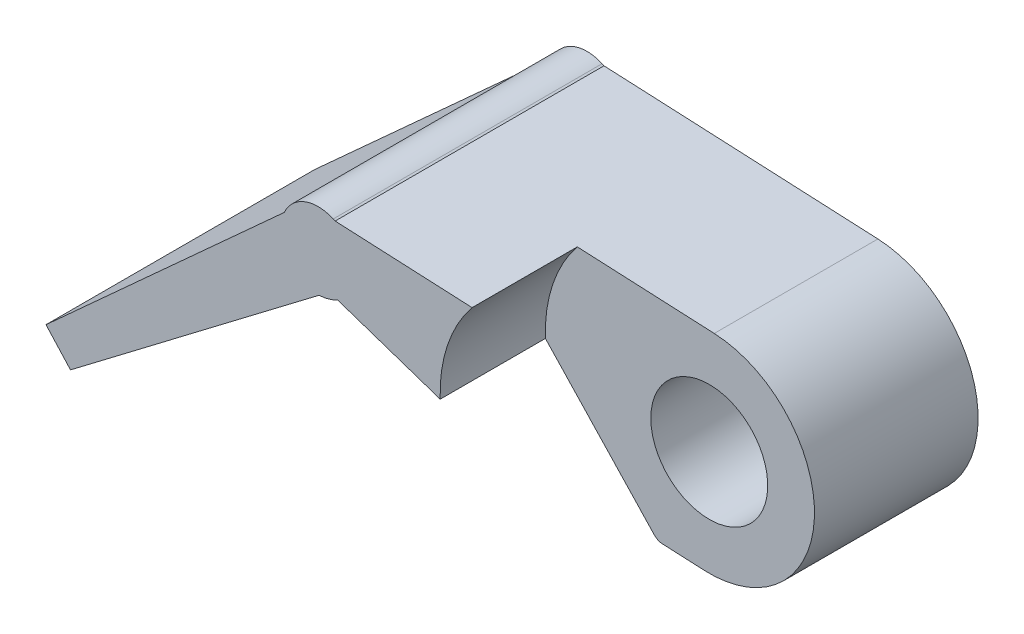
ISO-10303-21;
HEADER;
FILE_DESCRIPTION(('STEP AP214'),'2;1');
FILE_NAME('part.step','',(''),(''),'','','');
FILE_SCHEMA(('AUTOMOTIVE_DESIGN { 1 0 10303 214 1 1 1 1 }'));
ENDSEC;
DATA;
#1=APPLICATION_CONTEXT('core data for automotive mechanical design processes');
#2=APPLICATION_PROTOCOL_DEFINITION('international standard','automotive_design',2000,#1);
#3=PRODUCT_CONTEXT('',#1,'mechanical');
#4=PRODUCT('Part','Part','',(#3));
#5=PRODUCT_RELATED_PRODUCT_CATEGORY('part','',(#4));
#6=PRODUCT_DEFINITION_FORMATION('','',#4);
#7=PRODUCT_DEFINITION_CONTEXT('part definition',#1,'design');
#8=PRODUCT_DEFINITION('design','',#6,#7);
#9=PRODUCT_DEFINITION_SHAPE('','',#8);
#10=(LENGTH_UNIT() NAMED_UNIT(*) SI_UNIT(.MILLI.,.METRE.));
#11=(NAMED_UNIT(*) PLANE_ANGLE_UNIT() SI_UNIT($,.RADIAN.));
#12=(NAMED_UNIT(*) SI_UNIT($,.STERADIAN.) SOLID_ANGLE_UNIT());
#13=UNCERTAINTY_MEASURE_WITH_UNIT(LENGTH_MEASURE(1.E-05),#10,'distance_accuracy_value','');
#14=(GEOMETRIC_REPRESENTATION_CONTEXT(3) GLOBAL_UNCERTAINTY_ASSIGNED_CONTEXT((#13)) GLOBAL_UNIT_ASSIGNED_CONTEXT((#10,
#11,#12)) REPRESENTATION_CONTEXT('',''));
#15=CARTESIAN_POINT('',(0.,0.,0.));
#16=DIRECTION('',(0.,0.,1.));
#17=DIRECTION('',(1.,0.,0.));
#18=AXIS2_PLACEMENT_3D('',#15,#16,#17);
#19=CARTESIAN_POINT('',(-5.01413386203409,4.81339668661748,23.));
#20=DIRECTION('',(-0.605097912293867,0.796151063892779,0.));
#21=DIRECTION('',(-0.796151063892779,-0.605097912293867,0.));
#22=AXIS2_PLACEMENT_3D('',#19,#20,#21);
#23=PLANE('',#22);
#24=DIRECTION('',(0.796151063892779,0.605097912293867,0.));
#25=VECTOR('',#24,1.);
#26=CARTESIAN_POINT('',(-5.01413386203409,4.81339668661748,0.));
#27=LINE('',#26,#25);
#28=CARTESIAN_POINT('',(-26.2781109128153,-11.347842937406,0.));
#29=VERTEX_POINT('',#28);
#30=CARTESIAN_POINT('',(-5.01413386203409,4.8133966866175,0.));
#31=VERTEX_POINT('',#30);
#32=EDGE_CURVE('E157',#29,#31,#27,.T.);
#33=ORIENTED_EDGE('',*,*,#32,.T.);
#34=DIRECTION('',(0.,0.,-1.));
#35=VECTOR('',#34,1.);
#36=CARTESIAN_POINT('',(-5.01413386203409,4.8133966866175,23.));
#37=LINE('',#36,#35);
#38=CARTESIAN_POINT('',(-5.01413386203409,4.8133966866175,23.));
#39=VERTEX_POINT('',#38);
#40=EDGE_CURVE('E11',#39,#31,#37,.T.);
#41=ORIENTED_EDGE('',*,*,#40,.F.);
#42=DIRECTION('',(0.796151063892779,0.605097912293867,0.));
#43=VECTOR('',#42,1.);
#44=CARTESIAN_POINT('',(-5.01413386203409,4.81339668661748,23.));
#45=LINE('',#44,#43);
#46=CARTESIAN_POINT('',(-26.2781109128153,-11.347842937406,23.));
#47=VERTEX_POINT('',#46);
#48=EDGE_CURVE('E186',#47,#39,#45,.T.);
#49=ORIENTED_EDGE('',*,*,#48,.F.);
#50=DIRECTION('',(0.,0.,-1.));
#51=VECTOR('',#50,1.);
#52=CARTESIAN_POINT('',(-26.2781109128153,-11.347842937406,23.));
#53=LINE('',#52,#51);
#54=EDGE_CURVE('E153',#47,#29,#53,.T.);
#55=ORIENTED_EDGE('',*,*,#54,.T.);
#56=EDGE_LOOP('',(#33,#41,#49,#55));
#57=FACE_BOUND('',#56,.T.);
#58=ADVANCED_FACE('F38',(#57),#23,.F.);
#59=CARTESIAN_POINT('',(-5.18967507805901,8.54149962220621,23.));
#60=DIRECTION('',(0.,0.,-1.));
#61=DIRECTION('',(-1.,0.,0.));
#62=AXIS2_PLACEMENT_3D('',#59,#60,#61);
#63=CYLINDRICAL_SURFACE('',#62,3.73223340868021);
#64=CARTESIAN_POINT('',(-5.18967507805901,8.54149962220621,0.));
#65=DIRECTION('',(0.,0.,1.));
#66=DIRECTION('',(-1.,0.,0.));
#67=AXIS2_PLACEMENT_3D('',#64,#65,#66);
#68=CIRCLE('',#67,3.73223340868021);
#69=CARTESIAN_POINT('',(-3.41916315890911,5.25594734579715,0.));
#70=VERTEX_POINT('',#69);
#71=EDGE_CURVE('E160',#31,#70,#68,.T.);
#72=ORIENTED_EDGE('',*,*,#71,.T.);
#73=DIRECTION('',(0.,0.,-1.));
#74=VECTOR('',#73,1.);
#75=CARTESIAN_POINT('',(-3.41916315890911,5.25594734579715,23.));
#76=LINE('',#75,#74);
#77=CARTESIAN_POINT('',(-3.41916315890911,5.25594734579715,23.));
#78=VERTEX_POINT('',#77);
#79=EDGE_CURVE('E46',#78,#70,#76,.T.);
#80=ORIENTED_EDGE('',*,*,#79,.F.);
#81=CARTESIAN_POINT('',(-5.18967507805901,8.54149962220621,23.));
#82=DIRECTION('',(0.,0.,1.));
#83=DIRECTION('',(-1.,0.,0.));
#84=AXIS2_PLACEMENT_3D('',#81,#82,#83);
#85=CIRCLE('',#84,3.73223340868021);
#86=EDGE_CURVE('E115',#39,#78,#85,.T.);
#87=ORIENTED_EDGE('',*,*,#86,.F.);
#88=ORIENTED_EDGE('',*,*,#40,.T.);
#89=EDGE_LOOP('',(#72,#80,#87,#88));
#90=FACE_BOUND('',#89,.T.);
#91=ADVANCED_FACE('F294',(#90),#63,.T.);
#92=CARTESIAN_POINT('',(5.35012395046597,2.29655098349246,23.));
#93=DIRECTION('',(0.319755554751399,0.947500071348612,0.));
#94=DIRECTION('',(-0.947500071348612,0.319755554751399,0.));
#95=AXIS2_PLACEMENT_3D('',#92,#93,#94);
#96=PLANE('',#95);
#97=DIRECTION('',(0.947500071348612,-0.319755554751399,0.));
#98=VECTOR('',#97,1.);
#99=CARTESIAN_POINT('',(5.35012395046597,2.29655098349246,0.));
#100=LINE('',#99,#98);
#101=CARTESIAN_POINT('',(5.35012395046597,2.29655098349246,0.));
#102=VERTEX_POINT('',#101);
#103=EDGE_CURVE('E163',#70,#102,#100,.T.);
#104=ORIENTED_EDGE('',*,*,#103,.T.);
#105=DIRECTION('',(0.,0.,-1.));
#106=VECTOR('',#105,1.);
#107=CARTESIAN_POINT('',(5.35012395046597,2.29655098349246,23.));
#108=LINE('',#107,#106);
#109=CARTESIAN_POINT('',(5.35012395046597,2.29655098349246,14.));
#110=VERTEX_POINT('',#109);
#111=EDGE_CURVE('E201',#110,#102,#108,.T.);
#112=ORIENTED_EDGE('',*,*,#111,.F.);
#113=CARTESIAN_POINT('',(5.35012395046597,2.29655098349246,23.));
#114=VERTEX_POINT('',#113);
#115=EDGE_CURVE('E202',#114,#110,#108,.T.);
#116=ORIENTED_EDGE('',*,*,#115,.F.);
#117=DIRECTION('',(0.947500071348612,-0.319755554751399,0.));
#118=VECTOR('',#117,1.);
#119=CARTESIAN_POINT('',(5.35012395046597,2.29655098349246,23.));
#120=LINE('',#119,#118);
#121=EDGE_CURVE('E213',#78,#114,#120,.T.);
#122=ORIENTED_EDGE('',*,*,#121,.F.);
#123=ORIENTED_EDGE('',*,*,#79,.T.);
#124=EDGE_LOOP('',(#104,#112,#116,#122,#123));
#125=FACE_BOUND('',#124,.T.);
#126=ADVANCED_FACE('F209',(#125),#96,.F.);
#127=CARTESIAN_POINT('',(14.6682391848409,-7.6030309256872,23.));
#128=DIRECTION('',(0.728168359692758,0.685398307513492,0.));
#129=DIRECTION('',(-0.685398307513492,0.728168359692758,0.));
#130=AXIS2_PLACEMENT_3D('',#127,#128,#129);
#131=PLANE('',#130);
#132=DIRECTION('',(0.,0.,-1.));
#133=VECTOR('',#132,1.);
#134=CARTESIAN_POINT('',(14.6682391848409,-7.60303092568721,23.));
#135=LINE('',#134,#133);
#136=CARTESIAN_POINT('',(14.6682391848409,-7.60303092568721,14.));
#137=VERTEX_POINT('',#136);
#138=CARTESIAN_POINT('',(14.6682391848409,-7.60303092568721,0.));
#139=VERTEX_POINT('',#138);
#140=EDGE_CURVE('E199',#137,#139,#135,.T.);
#141=ORIENTED_EDGE('',*,*,#140,.F.);
#142=DIRECTION('',(0.685398307513491,-0.728168359692758,0.));
#143=VECTOR('',#142,1.);
#144=CARTESIAN_POINT('',(14.6682391848409,-7.60303092568721,14.));
#145=LINE('',#144,#143);
#146=EDGE_CURVE('E226',#110,#137,#145,.T.);
#147=ORIENTED_EDGE('',*,*,#146,.F.);
#148=ORIENTED_EDGE('',*,*,#111,.T.);
#149=DIRECTION('',(0.685398307513492,-0.728168359692758,0.));
#150=VECTOR('',#149,1.);
#151=CARTESIAN_POINT('',(14.6682391848409,-7.6030309256872,0.));
#152=LINE('',#151,#150);
#153=EDGE_CURVE('E166',#102,#139,#152,.T.);
#154=ORIENTED_EDGE('',*,*,#153,.T.);
#155=EDGE_LOOP('',(#141,#147,#148,#154));
#156=FACE_BOUND('',#155,.T.);
#157=ADVANCED_FACE('F221',(#156),#131,.F.);
#158=CARTESIAN_POINT('',(15.3964795465158,-6.91746771640406,23.));
#159=DIRECTION('',(0.,0.,-1.));
#160=DIRECTION('',(-1.,0.,0.));
#161=AXIS2_PLACEMENT_3D('',#158,#159,#160);
#162=CYLINDRICAL_SURFACE('',#161,1.00016545545972);
#163=DIRECTION('',(0.,0.,-1.));
#164=VECTOR('',#163,1.);
#165=CARTESIAN_POINT('',(15.3487385625956,-7.91649310984974,23.));
#166=LINE('',#165,#164);
#167=CARTESIAN_POINT('',(15.3487385625956,-7.91649310984974,14.));
#168=VERTEX_POINT('',#167);
#169=CARTESIAN_POINT('',(15.3487385625956,-7.91649310984974,0.));
#170=VERTEX_POINT('',#169);
#171=EDGE_CURVE('E197',#168,#170,#166,.T.);
#172=ORIENTED_EDGE('',*,*,#171,.F.);
#173=CARTESIAN_POINT('',(15.3964795465158,-6.91746771640405,14.));
#174=DIRECTION('',(0.,0.,1.));
#175=DIRECTION('',(-1.,0.,0.));
#176=AXIS2_PLACEMENT_3D('',#173,#174,#175);
#177=CIRCLE('',#176,1.00016545545973);
#178=EDGE_CURVE('E249',#137,#168,#177,.T.);
#179=ORIENTED_EDGE('',*,*,#178,.F.);
#180=ORIENTED_EDGE('',*,*,#140,.T.);
#181=CARTESIAN_POINT('',(15.3964795465158,-6.91746771640406,0.));
#182=DIRECTION('',(0.,0.,1.));
#183=DIRECTION('',(-1.,0.,0.));
#184=AXIS2_PLACEMENT_3D('',#181,#182,#183);
#185=CIRCLE('',#184,1.00016545545972);
#186=EDGE_CURVE('E169',#139,#170,#185,.T.);
#187=ORIENTED_EDGE('',*,*,#186,.T.);
#188=EDGE_LOOP('',(#172,#179,#180,#187));
#189=FACE_BOUND('',#188,.T.);
#190=ADVANCED_FACE('F323',(#189),#162,.T.);
#191=CARTESIAN_POINT('',(18.9405780520203,-8.08813834773202,23.));
#192=DIRECTION('',(0.0477330862204361,0.998860126584234,0.));
#193=DIRECTION('',(-0.998860126584234,0.0477330862204361,0.));
#194=AXIS2_PLACEMENT_3D('',#191,#192,#193);
#195=PLANE('',#194);
#196=DIRECTION('',(0.,0.,-1.));
#197=VECTOR('',#196,1.);
#198=CARTESIAN_POINT('',(18.9405780520203,-8.08813834773201,23.));
#199=LINE('',#198,#197);
#200=CARTESIAN_POINT('',(18.9405780520203,-8.08813834773201,14.));
#201=VERTEX_POINT('',#200);
#202=CARTESIAN_POINT('',(18.9405780520203,-8.08813834773201,0.));
#203=VERTEX_POINT('',#202);
#204=EDGE_CURVE('E195',#201,#203,#199,.T.);
#205=ORIENTED_EDGE('',*,*,#204,.F.);
#206=DIRECTION('',(0.998860126584234,-0.0477330862204357,0.));
#207=VECTOR('',#206,1.);
#208=CARTESIAN_POINT('',(18.9405780520203,-8.08813834773201,14.));
#209=LINE('',#208,#207);
#210=EDGE_CURVE('E241',#168,#201,#209,.T.);
#211=ORIENTED_EDGE('',*,*,#210,.F.);
#212=ORIENTED_EDGE('',*,*,#171,.T.);
#213=DIRECTION('',(0.998860126584234,-0.0477330862204361,0.));
#214=VECTOR('',#213,1.);
#215=CARTESIAN_POINT('',(18.9405780520203,-8.08813834773202,0.));
#216=LINE('',#215,#214);
#217=EDGE_CURVE('E172',#170,#203,#216,.T.);
#218=ORIENTED_EDGE('',*,*,#217,.T.);
#219=EDGE_LOOP('',(#205,#211,#212,#218));
#220=FACE_BOUND('',#219,.T.);
#221=ADVANCED_FACE('F260',(#220),#195,.F.);
#222=CARTESIAN_POINT('',(19.3672818656217,0.900777551244255,23.));
#223=DIRECTION('',(0.,0.,-1.));
#224=DIRECTION('',(-1.,0.,0.));
#225=AXIS2_PLACEMENT_3D('',#222,#223,#224);
#226=CYLINDRICAL_SURFACE('',#225,8.999038014333);
#227=DIRECTION('',(0.,0.,-1.));
#228=VECTOR('',#227,1.);
#229=CARTESIAN_POINT('',(19.7939856792232,9.88969345022052,23.));
#230=LINE('',#229,#228);
#231=CARTESIAN_POINT('',(19.7939856792232,9.88969345022052,14.));
#232=VERTEX_POINT('',#231);
#233=CARTESIAN_POINT('',(19.7939856792232,9.88969345022052,0.));
#234=VERTEX_POINT('',#233);
#235=EDGE_CURVE('E193',#232,#234,#230,.T.);
#236=ORIENTED_EDGE('',*,*,#235,.F.);
#237=CARTESIAN_POINT('',(19.3672818656217,0.900777551244254,14.));
#238=DIRECTION('',(0.,0.,1.));
#239=DIRECTION('',(-1.,0.,0.));
#240=AXIS2_PLACEMENT_3D('',#237,#238,#239);
#241=CIRCLE('',#240,8.999038014333);
#242=EDGE_CURVE('E246',#201,#232,#241,.T.);
#243=ORIENTED_EDGE('',*,*,#242,.F.);
#244=ORIENTED_EDGE('',*,*,#204,.T.);
#245=CARTESIAN_POINT('',(19.3672818656217,0.900777551244255,0.));
#246=DIRECTION('',(0.,0.,1.));
#247=DIRECTION('',(-1.,0.,0.));
#248=AXIS2_PLACEMENT_3D('',#245,#246,#247);
#249=CIRCLE('',#248,8.999038014333);
#250=EDGE_CURVE('E175',#203,#234,#249,.T.);
#251=ORIENTED_EDGE('',*,*,#250,.T.);
#252=EDGE_LOOP('',(#236,#243,#244,#251));
#253=FACE_BOUND('',#252,.T.);
#254=ADVANCED_FACE('F256',(#253),#226,.T.);
#255=CARTESIAN_POINT('',(-3.63753671352174,11.0019877553225,23.));
#256=DIRECTION('',(-0.0474166030771076,-0.998875200289119,0.));
#257=DIRECTION('',(0.998875200289119,-0.0474166030771076,0.));
#258=AXIS2_PLACEMENT_3D('',#255,#256,#257);
#259=PLANE('',#258);
#260=DIRECTION('',(-0.998875200289119,0.0474166030771076,0.));
#261=VECTOR('',#260,1.);
#262=CARTESIAN_POINT('',(-3.63753671352174,11.0019877553225,23.));
#263=LINE('',#262,#261);
#264=CARTESIAN_POINT('',(8.07822448285072,10.4458406027715,23.));
#265=VERTEX_POINT('',#264);
#266=CARTESIAN_POINT('',(-3.63753671352174,11.0019877553225,23.));
#267=VERTEX_POINT('',#266);
#268=EDGE_CURVE('E270',#265,#267,#263,.T.);
#269=ORIENTED_EDGE('',*,*,#268,.F.);
#270=DIRECTION('',(0.,0.,1.));
#271=VECTOR('',#270,1.);
#272=CARTESIAN_POINT('',(8.07822448285072,10.4458406027715,14.));
#273=LINE('',#272,#271);
#274=CARTESIAN_POINT('',(8.07822448285072,10.4458406027715,14.));
#275=VERTEX_POINT('',#274);
#276=EDGE_CURVE('E53',#275,#265,#273,.T.);
#277=ORIENTED_EDGE('',*,*,#276,.F.);
#278=DIRECTION('',(-0.998875200289119,0.0474166030771077,0.));
#279=VECTOR('',#278,1.);
#280=CARTESIAN_POINT('',(8.07822448285072,10.4458406027715,14.));
#281=LINE('',#280,#279);
#282=EDGE_CURVE('E257',#232,#275,#281,.T.);
#283=ORIENTED_EDGE('',*,*,#282,.F.);
#284=ORIENTED_EDGE('',*,*,#235,.T.);
#285=DIRECTION('',(-0.998875200289119,0.0474166030771076,0.));
#286=VECTOR('',#285,1.);
#287=CARTESIAN_POINT('',(-3.63753671352174,11.0019877553225,0.));
#288=LINE('',#287,#286);
#289=CARTESIAN_POINT('',(-3.63753671352174,11.0019877553225,0.));
#290=VERTEX_POINT('',#289);
#291=EDGE_CURVE('E178',#234,#290,#288,.T.);
#292=ORIENTED_EDGE('',*,*,#291,.T.);
#293=DIRECTION('',(0.,0.,-1.));
#294=VECTOR('',#293,1.);
#295=CARTESIAN_POINT('',(-3.63753671352174,11.0019877553225,23.));
#296=LINE('',#295,#294);
#297=EDGE_CURVE('E190',#267,#290,#296,.T.);
#298=ORIENTED_EDGE('',*,*,#297,.F.);
#299=EDGE_LOOP('',(#269,#277,#283,#284,#292,#298));
#300=FACE_BOUND('',#299,.T.);
#301=ADVANCED_FACE('F267',(#300),#259,.F.);
#302=CARTESIAN_POINT('',(-3.80093806125281,11.0745661202112,23.));
#303=DIRECTION('',(-0.405930824808933,-0.913903805370094,0.));
#304=DIRECTION('',(0.913903805370095,-0.405930824808933,0.));
#305=AXIS2_PLACEMENT_3D('',#302,#303,#304);
#306=PLANE('',#305);
#307=DIRECTION('',(-0.913903805370094,0.405930824808933,0.));
#308=VECTOR('',#307,1.);
#309=CARTESIAN_POINT('',(-3.80093806125281,11.0745661202112,0.));
#310=LINE('',#309,#308);
#311=CARTESIAN_POINT('',(-3.8009380612528,11.0745661202112,0.));
#312=VERTEX_POINT('',#311);
#313=EDGE_CURVE('E180',#290,#312,#310,.T.);
#314=ORIENTED_EDGE('',*,*,#313,.T.);
#315=DIRECTION('',(0.,0.,-1.));
#316=VECTOR('',#315,1.);
#317=CARTESIAN_POINT('',(-3.8009380612528,11.0745661202112,23.));
#318=LINE('',#317,#316);
#319=CARTESIAN_POINT('',(-3.8009380612528,11.0745661202112,23.));
#320=VERTEX_POINT('',#319);
#321=EDGE_CURVE('E148',#320,#312,#318,.T.);
#322=ORIENTED_EDGE('',*,*,#321,.F.);
#323=DIRECTION('',(-0.913903805370094,0.405930824808933,0.));
#324=VECTOR('',#323,1.);
#325=CARTESIAN_POINT('',(-3.80093806125281,11.0745661202112,23.));
#326=LINE('',#325,#324);
#327=EDGE_CURVE('E136',#267,#320,#326,.T.);
#328=ORIENTED_EDGE('',*,*,#327,.F.);
#329=ORIENTED_EDGE('',*,*,#297,.T.);
#330=EDGE_LOOP('',(#314,#322,#328,#329));
#331=FACE_BOUND('',#330,.T.);
#332=ADVANCED_FACE('F269',(#331),#306,.F.);
#333=CARTESIAN_POINT('',(-5.0893978390848,8.17375587851188,23.));
#334=DIRECTION('',(0.,0.,-1.));
#335=DIRECTION('',(-1.,0.,0.));
#336=AXIS2_PLACEMENT_3D('',#333,#334,#335);
#337=CYLINDRICAL_SURFACE('',#336,3.17408705889406);
#338=CARTESIAN_POINT('',(-5.0893978390848,8.17375587851188,0.));
#339=DIRECTION('',(0.,0.,1.));
#340=DIRECTION('',(-1.,0.,0.));
#341=AXIS2_PLACEMENT_3D('',#338,#339,#340);
#342=CIRCLE('',#341,3.17408705889406);
#343=CARTESIAN_POINT('',(-7.9902080807841,9.46221565634403,0.));
#344=VERTEX_POINT('',#343);
#345=EDGE_CURVE('E145',#312,#344,#342,.T.);
#346=ORIENTED_EDGE('',*,*,#345,.T.);
#347=DIRECTION('',(0.,0.,-1.));
#348=VECTOR('',#347,1.);
#349=CARTESIAN_POINT('',(-7.9902080807841,9.46221565634403,23.));
#350=LINE('',#349,#348);
#351=CARTESIAN_POINT('',(-7.9902080807841,9.46221565634403,23.));
#352=VERTEX_POINT('',#351);
#353=EDGE_CURVE('E142',#352,#344,#350,.T.);
#354=ORIENTED_EDGE('',*,*,#353,.F.);
#355=CARTESIAN_POINT('',(-5.0893978390848,8.17375587851188,23.));
#356=DIRECTION('',(0.,0.,1.));
#357=DIRECTION('',(-1.,0.,0.));
#358=AXIS2_PLACEMENT_3D('',#355,#356,#357);
#359=CIRCLE('',#358,3.17408705889406);
#360=EDGE_CURVE('E128',#320,#352,#359,.T.);
#361=ORIENTED_EDGE('',*,*,#360,.F.);
#362=ORIENTED_EDGE('',*,*,#321,.T.);
#363=EDGE_LOOP('',(#346,#354,#361,#362));
#364=FACE_BOUND('',#363,.T.);
#365=ADVANCED_FACE('F143',(#364),#337,.T.);
#366=CARTESIAN_POINT('',(-28.3721660885966,-9.04384208291378,23.));
#367=DIRECTION('',(0.672215344748669,-0.740355678227991,0.));
#368=DIRECTION('',(0.740355678227991,0.672215344748669,0.));
#369=AXIS2_PLACEMENT_3D('',#366,#367,#368);
#370=PLANE('',#369);
#371=DIRECTION('',(-0.740355678227991,-0.672215344748669,0.));
#372=VECTOR('',#371,1.);
#373=CARTESIAN_POINT('',(-28.3721660885966,-9.04384208291378,0.));
#374=LINE('',#373,#372);
#375=CARTESIAN_POINT('',(-28.3721660885966,-9.04384208291378,0.));
#376=VERTEX_POINT('',#375);
#377=EDGE_CURVE('E183',#344,#376,#374,.T.);
#378=ORIENTED_EDGE('',*,*,#377,.T.);
#379=DIRECTION('',(0.,0.,-1.));
#380=VECTOR('',#379,1.);
#381=CARTESIAN_POINT('',(-28.3721660885966,-9.04384208291378,23.));
#382=LINE('',#381,#380);
#383=CARTESIAN_POINT('',(-28.3721660885966,-9.04384208291378,23.));
#384=VERTEX_POINT('',#383);
#385=EDGE_CURVE('E149',#384,#376,#382,.T.);
#386=ORIENTED_EDGE('',*,*,#385,.F.);
#387=DIRECTION('',(-0.740355678227991,-0.672215344748669,0.));
#388=VECTOR('',#387,1.);
#389=CARTESIAN_POINT('',(-28.3721660885966,-9.04384208291378,23.));
#390=LINE('',#389,#388);
#391=EDGE_CURVE('E133',#352,#384,#390,.T.);
#392=ORIENTED_EDGE('',*,*,#391,.F.);
#393=ORIENTED_EDGE('',*,*,#353,.T.);
#394=EDGE_LOOP('',(#378,#386,#392,#393));
#395=FACE_BOUND('',#394,.T.);
#396=ADVANCED_FACE('F151',(#395),#370,.F.);
#397=CARTESIAN_POINT('',(-26.2781109128153,-11.347842937406,23.));
#398=DIRECTION('',(0.740018572222376,0.672586435163508,0.));
#399=DIRECTION('',(-0.672586435163508,0.740018572222376,0.));
#400=AXIS2_PLACEMENT_3D('',#397,#398,#399);
#401=PLANE('',#400);
#402=DIRECTION('',(0.672586435163508,-0.740018572222376,0.));
#403=VECTOR('',#402,1.);
#404=CARTESIAN_POINT('',(-26.2781109128153,-11.347842937406,0.));
#405=LINE('',#404,#403);
#406=EDGE_CURVE('E107',#376,#29,#405,.T.);
#407=ORIENTED_EDGE('',*,*,#406,.T.);
#408=ORIENTED_EDGE('',*,*,#54,.F.);
#409=DIRECTION('',(0.672586435163508,-0.740018572222376,0.));
#410=VECTOR('',#409,1.);
#411=CARTESIAN_POINT('',(-26.2781109128153,-11.347842937406,23.));
#412=LINE('',#411,#410);
#413=EDGE_CURVE('E62',#384,#47,#412,.T.);
#414=ORIENTED_EDGE('',*,*,#413,.F.);
#415=ORIENTED_EDGE('',*,*,#385,.T.);
#416=EDGE_LOOP('',(#407,#408,#414,#415));
#417=FACE_BOUND('',#416,.T.);
#418=ADVANCED_FACE('F301',(#417),#401,.F.);
#419=CARTESIAN_POINT('',(-5.0893978390848,8.17375587851188,23.));
#420=DIRECTION('',(0.,0.,-1.));
#421=DIRECTION('',(-1.,0.,0.));
#422=AXIS2_PLACEMENT_3D('',#419,#420,#421);
#423=PLANE('',#422);
#424=ORIENTED_EDGE('',*,*,#121,.T.);
#425=CARTESIAN_POINT('',(17.5837726307212,2.73242988768897,23.));
#426=DIRECTION('',(0.,0.,1.));
#427=DIRECTION('',(-1.,0.,0.));
#428=AXIS2_PLACEMENT_3D('',#425,#426,#427);
#429=CIRCLE('',#428,12.2414112932714);
#430=EDGE_CURVE('E258',#265,#114,#429,.T.);
#431=ORIENTED_EDGE('',*,*,#430,.F.);
#432=ORIENTED_EDGE('',*,*,#268,.T.);
#433=ORIENTED_EDGE('',*,*,#327,.T.);
#434=ORIENTED_EDGE('',*,*,#360,.T.);
#435=ORIENTED_EDGE('',*,*,#391,.T.);
#436=ORIENTED_EDGE('',*,*,#413,.T.);
#437=ORIENTED_EDGE('',*,*,#48,.T.);
#438=ORIENTED_EDGE('',*,*,#86,.T.);
#439=EDGE_LOOP('',(#424,#431,#432,#433,#434,#435,#436,#437,#438));
#440=FACE_BOUND('',#439,.T.);
#441=ADVANCED_FACE('F131',(#440),#423,.F.);
#442=CARTESIAN_POINT('',(-5.0893978390848,8.17375587851188,0.));
#443=DIRECTION('',(0.,0.,-1.));
#444=DIRECTION('',(-1.,0.,0.));
#445=AXIS2_PLACEMENT_3D('',#442,#443,#444);
#446=PLANE('',#445);
#447=CARTESIAN_POINT('',(19.3672818656217,0.900777551244255,0.));
#448=DIRECTION('',(0.,0.,-1.));
#449=DIRECTION('',(-1.,0.,0.));
#450=AXIS2_PLACEMENT_3D('',#447,#448,#449);
#451=CIRCLE('',#450,5.);
#452=CARTESIAN_POINT('',(14.3672818656217,0.900777551244255,0.));
#453=VERTEX_POINT('',#452);
#454=EDGE_CURVE('E161',#453,#453,#451,.T.);
#455=ORIENTED_EDGE('',*,*,#454,.F.);
#456=EDGE_LOOP('',(#455));
#457=FACE_BOUND('',#456,.T.);
#458=ORIENTED_EDGE('',*,*,#32,.F.);
#459=ORIENTED_EDGE('',*,*,#406,.F.);
#460=ORIENTED_EDGE('',*,*,#377,.F.);
#461=ORIENTED_EDGE('',*,*,#345,.F.);
#462=ORIENTED_EDGE('',*,*,#313,.F.);
#463=ORIENTED_EDGE('',*,*,#291,.F.);
#464=ORIENTED_EDGE('',*,*,#250,.F.);
#465=ORIENTED_EDGE('',*,*,#217,.F.);
#466=ORIENTED_EDGE('',*,*,#186,.F.);
#467=ORIENTED_EDGE('',*,*,#153,.F.);
#468=ORIENTED_EDGE('',*,*,#103,.F.);
#469=ORIENTED_EDGE('',*,*,#71,.F.);
#470=EDGE_LOOP('',(#458,#459,#460,#461,#462,#463,#464,#465,#466,#467,#468,#469));
#471=FACE_BOUND('',#470,.T.);
#472=ADVANCED_FACE('F216',(#457,#471),#446,.T.);
#473=CARTESIAN_POINT('',(19.3672818656217,0.900777551244255,28.));
#474=DIRECTION('',(0.,0.,-1.));
#475=DIRECTION('',(-1.,0.,0.));
#476=AXIS2_PLACEMENT_3D('',#473,#474,#475);
#477=CYLINDRICAL_SURFACE('',#476,5.);
#478=CARTESIAN_POINT('',(19.3672818656217,0.900777551244255,14.));
#479=DIRECTION('',(0.,0.,-1.));
#480=DIRECTION('',(-1.,0.,0.));
#481=AXIS2_PLACEMENT_3D('',#478,#479,#480);
#482=CIRCLE('',#481,5.);
#483=CARTESIAN_POINT('',(14.3672818656217,0.900777551244255,14.));
#484=VERTEX_POINT('',#483);
#485=EDGE_CURVE('E41',#484,#484,#482,.F.);
#486=CARTESIAN_POINT('',(14.3672818656217,0.900777551244255,14.));
#487=CARTESIAN_POINT('',(14.3672818656217,0.900777551244255,13.8541666666667));
#488=CARTESIAN_POINT('',(14.3672818656217,0.900777551244255,13.7083333333333));
#489=CARTESIAN_POINT('',(14.3672818656217,0.900777551244255,13.4166666666667));
#490=CARTESIAN_POINT('',(14.3672818656217,0.900777551244255,13.2708333333333));
#491=CARTESIAN_POINT('',(14.3672818656217,0.900777551244255,12.9791666666667));
#492=CARTESIAN_POINT('',(14.3672818656217,0.900777551244255,12.8333333333333));
#493=CARTESIAN_POINT('',(14.3672818656217,0.900777551244255,12.5416666666667));
#494=CARTESIAN_POINT('',(14.3672818656217,0.900777551244255,12.3958333333333));
#495=CARTESIAN_POINT('',(14.3672818656217,0.900777551244255,12.1041666666667));
#496=CARTESIAN_POINT('',(14.3672818656217,0.900777551244255,11.9583333333333));
#497=CARTESIAN_POINT('',(14.3672818656217,0.900777551244255,11.6666666666667));
#498=CARTESIAN_POINT('',(14.3672818656217,0.900777551244255,11.5208333333333));
#499=CARTESIAN_POINT('',(14.3672818656217,0.900777551244255,11.2291666666667));
#500=CARTESIAN_POINT('',(14.3672818656217,0.900777551244255,11.0833333333333));
#501=CARTESIAN_POINT('',(14.3672818656217,0.900777551244255,10.7916666666667));
#502=CARTESIAN_POINT('',(14.3672818656217,0.900777551244255,10.6458333333333));
#503=CARTESIAN_POINT('',(14.3672818656217,0.900777551244255,10.3541666666667));
#504=CARTESIAN_POINT('',(14.3672818656217,0.900777551244255,10.2083333333333));
#505=CARTESIAN_POINT('',(14.3672818656217,0.900777551244255,9.91666666666667));
#506=CARTESIAN_POINT('',(14.3672818656217,0.900777551244255,9.77083333333333));
#507=CARTESIAN_POINT('',(14.3672818656217,0.900777551244255,9.47916666666667));
#508=CARTESIAN_POINT('',(14.3672818656217,0.900777551244255,9.33333333333334));
#509=CARTESIAN_POINT('',(14.3672818656217,0.900777551244255,9.04166666666667));
#510=CARTESIAN_POINT('',(14.3672818656217,0.900777551244255,8.89583333333334));
#511=CARTESIAN_POINT('',(14.3672818656217,0.900777551244255,8.60416666666667));
#512=CARTESIAN_POINT('',(14.3672818656217,0.900777551244255,8.45833333333334));
#513=CARTESIAN_POINT('',(14.3672818656217,0.900777551244255,8.16666666666667));
#514=CARTESIAN_POINT('',(14.3672818656217,0.900777551244255,8.02083333333334));
#515=CARTESIAN_POINT('',(14.3672818656217,0.900777551244255,7.72916666666667));
#516=CARTESIAN_POINT('',(14.3672818656217,0.900777551244255,7.58333333333334));
#517=CARTESIAN_POINT('',(14.3672818656217,0.900777551244255,7.29166666666667));
#518=CARTESIAN_POINT('',(14.3672818656217,0.900777551244255,7.14583333333334));
#519=CARTESIAN_POINT('',(14.3672818656217,0.900777551244255,6.85416666666667));
#520=CARTESIAN_POINT('',(14.3672818656217,0.900777551244255,6.70833333333334));
#521=CARTESIAN_POINT('',(14.3672818656217,0.900777551244255,6.41666666666667));
#522=CARTESIAN_POINT('',(14.3672818656217,0.900777551244255,6.27083333333334));
#523=CARTESIAN_POINT('',(14.3672818656217,0.900777551244255,5.97916666666667));
#524=CARTESIAN_POINT('',(14.3672818656217,0.900777551244255,5.83333333333334));
#525=CARTESIAN_POINT('',(14.3672818656217,0.900777551244255,5.54166666666667));
#526=CARTESIAN_POINT('',(14.3672818656217,0.900777551244255,5.39583333333333));
#527=CARTESIAN_POINT('',(14.3672818656217,0.900777551244255,5.10416666666667));
#528=CARTESIAN_POINT('',(14.3672818656217,0.900777551244255,4.95833333333333));
#529=CARTESIAN_POINT('',(14.3672818656217,0.900777551244255,4.66666666666667));
#530=CARTESIAN_POINT('',(14.3672818656217,0.900777551244255,4.52083333333334));
#531=CARTESIAN_POINT('',(14.3672818656217,0.900777551244255,4.22916666666667));
#532=CARTESIAN_POINT('',(14.3672818656217,0.900777551244255,4.08333333333334));
#533=CARTESIAN_POINT('',(14.3672818656217,0.900777551244255,3.79166666666667));
#534=CARTESIAN_POINT('',(14.3672818656217,0.900777551244255,3.64583333333334));
#535=CARTESIAN_POINT('',(14.3672818656217,0.900777551244255,3.35416666666667));
#536=CARTESIAN_POINT('',(14.3672818656217,0.900777551244255,3.20833333333334));
#537=CARTESIAN_POINT('',(14.3672818656217,0.900777551244255,2.91666666666667));
#538=CARTESIAN_POINT('',(14.3672818656217,0.900777551244255,2.77083333333334));
#539=CARTESIAN_POINT('',(14.3672818656217,0.900777551244255,2.47916666666667));
#540=CARTESIAN_POINT('',(14.3672818656217,0.900777551244255,2.33333333333334));
#541=CARTESIAN_POINT('',(14.3672818656217,0.900777551244255,2.04166666666667));
#542=CARTESIAN_POINT('',(14.3672818656217,0.900777551244255,1.89583333333334));
#543=CARTESIAN_POINT('',(14.3672818656217,0.900777551244255,1.60416666666667));
#544=CARTESIAN_POINT('',(14.3672818656217,0.900777551244255,1.45833333333334));
#545=CARTESIAN_POINT('',(14.3672818656217,0.900777551244255,1.16666666666667));
#546=CARTESIAN_POINT('',(14.3672818656217,0.900777551244255,1.02083333333334));
#547=CARTESIAN_POINT('',(14.3672818656217,0.900777551244255,0.729166666666671));
#548=CARTESIAN_POINT('',(14.3672818656217,0.900777551244255,0.583333333333337));
#549=CARTESIAN_POINT('',(14.3672818656217,0.900777551244255,0.29166666666667));
#550=CARTESIAN_POINT('',(14.3672818656217,0.900777551244255,0.145833333333337));
#551=CARTESIAN_POINT('',(14.3672818656217,0.900777551244255,0.));
#552=B_SPLINE_CURVE_WITH_KNOTS('',3,(#486,#487,#488,#489,#490,#491,#492,#493,#494,#495,#496,
#497,#498,#499,#500,#501,#502,#503,#504,#505,#506,#507,#508,#509,#510,#511,#512,#513,#514,#515,
#516,#517,#518,#519,#520,#521,#522,#523,#524,#525,#526,#527,#528,#529,#530,#531,#532,#533,#534,
#535,#536,#537,#538,#539,#540,#541,#542,#543,#544,#545,#546,#547,#548,#549,#550,#551),
.UNSPECIFIED.,.F.,.F.,(4,2,2,2,2,2,2,2,2,2,2,2,2,2,2,2,2,2,2,2,2,2,2,2,2,2,2,2,2,2,2,2,4),(0.,
0.4375,0.875000000000001,1.3125,1.75,2.1875,2.625,3.0625,3.5,3.9375,4.375,4.8125,5.25,5.6875,
6.125,6.5625,7.,7.4375,7.875,8.3125,8.75,9.1875,9.625,10.0625,10.5,10.9375,11.375,11.8125,12.25,
12.6875,13.125,13.5625,14.),.UNSPECIFIED.);
#553=EDGE_CURVE('BSEAM290',#484,#453,#552,.T.);
#554=ORIENTED_EDGE('',*,*,#485,.T.);
#555=ORIENTED_EDGE('',*,*,#454,.T.);
#556=ORIENTED_EDGE('',*,*,#553,.T.);
#557=ORIENTED_EDGE('',*,*,#553,.F.);
#558=EDGE_LOOP('',(#554,#556,#555,#557));
#559=FACE_BOUND('',#558,.T.);
#560=ADVANCED_FACE('F290',(#559),#477,.F.);
#561=CARTESIAN_POINT('',(19.3672818656217,0.900777551244254,14.));
#562=DIRECTION('',(0.,0.,-1.));
#563=DIRECTION('',(-1.,0.,0.));
#564=AXIS2_PLACEMENT_3D('',#561,#562,#563);
#565=PLANE('',#564);
#566=ORIENTED_EDGE('',*,*,#242,.T.);
#567=ORIENTED_EDGE('',*,*,#282,.T.);
#568=CARTESIAN_POINT('',(17.5837726307212,2.73242988768897,14.));
#569=DIRECTION('',(0.,0.,1.));
#570=DIRECTION('',(-1.,0.,0.));
#571=AXIS2_PLACEMENT_3D('',#568,#569,#570);
#572=CIRCLE('',#571,12.2414112932714);
#573=EDGE_CURVE('E282',#275,#110,#572,.T.);
#574=ORIENTED_EDGE('',*,*,#573,.T.);
#575=ORIENTED_EDGE('',*,*,#146,.T.);
#576=ORIENTED_EDGE('',*,*,#178,.T.);
#577=ORIENTED_EDGE('',*,*,#210,.T.);
#578=EDGE_LOOP('',(#566,#567,#574,#575,#576,#577));
#579=FACE_BOUND('',#578,.T.);
#580=ORIENTED_EDGE('',*,*,#485,.F.);
#581=EDGE_LOOP('',(#580));
#582=FACE_BOUND('',#581,.T.);
#583=ADVANCED_FACE('F243',(#579,#582),#565,.F.);
#584=CARTESIAN_POINT('',(17.5837726307212,2.73242988768897,14.));
#585=DIRECTION('',(0.,0.,1.));
#586=DIRECTION('',(1.,0.,0.));
#587=AXIS2_PLACEMENT_3D('',#584,#585,#586);
#588=CYLINDRICAL_SURFACE('',#587,12.2414112932714);
#589=ORIENTED_EDGE('',*,*,#430,.T.);
#590=ORIENTED_EDGE('',*,*,#115,.T.);
#591=ORIENTED_EDGE('',*,*,#573,.F.);
#592=ORIENTED_EDGE('',*,*,#276,.T.);
#593=EDGE_LOOP('',(#589,#590,#591,#592));
#594=FACE_BOUND('',#593,.T.);
#595=ADVANCED_FACE('F284',(#594),#588,.F.);
#596=CLOSED_SHELL('',(#58,#91,#126,#157,#190,#221,#254,#301,#332,#365,#396,#418,#441,#472,#560,
#583,#595));
#597=MANIFOLD_SOLID_BREP('B2',#596);
#598=ADVANCED_BREP_SHAPE_REPRESENTATION('',(#18,#597),#14);
#599=SHAPE_DEFINITION_REPRESENTATION(#9,#598);
ENDSEC;
END-ISO-10303-21;
